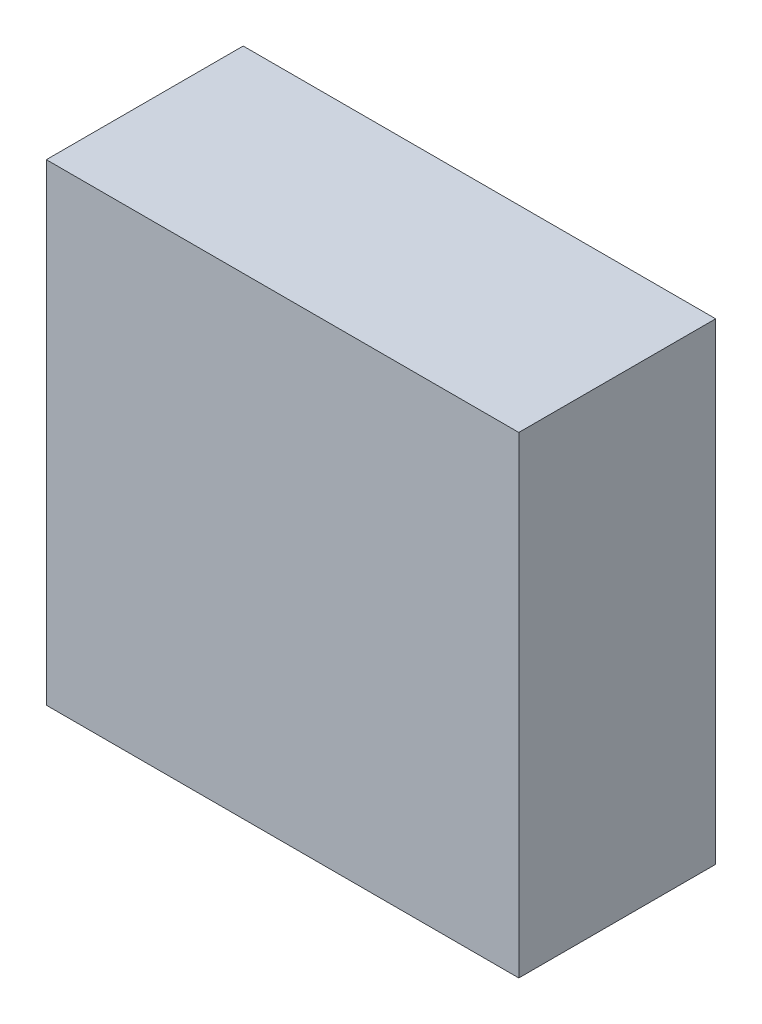
ISO-10303-21;
HEADER;
FILE_DESCRIPTION(('STEP AP214'),'2;1');
FILE_NAME('part.step','',(''),(''),'','','');
FILE_SCHEMA(('AUTOMOTIVE_DESIGN { 1 0 10303 214 1 1 1 1 }'));
ENDSEC;
DATA;
#1=APPLICATION_CONTEXT('core data for automotive mechanical design processes');
#2=APPLICATION_PROTOCOL_DEFINITION('international standard','automotive_design',2000,#1);
#3=PRODUCT_CONTEXT('',#1,'mechanical');
#4=PRODUCT('Part','Part','',(#3));
#5=PRODUCT_RELATED_PRODUCT_CATEGORY('part','',(#4));
#6=PRODUCT_DEFINITION_FORMATION('','',#4);
#7=PRODUCT_DEFINITION_CONTEXT('part definition',#1,'design');
#8=PRODUCT_DEFINITION('design','',#6,#7);
#9=PRODUCT_DEFINITION_SHAPE('','',#8);
#10=(LENGTH_UNIT() NAMED_UNIT(*) SI_UNIT(.MILLI.,.METRE.));
#11=(NAMED_UNIT(*) PLANE_ANGLE_UNIT() SI_UNIT($,.RADIAN.));
#12=(NAMED_UNIT(*) SI_UNIT($,.STERADIAN.) SOLID_ANGLE_UNIT());
#13=UNCERTAINTY_MEASURE_WITH_UNIT(LENGTH_MEASURE(1.E-05),#10,'distance_accuracy_value','');
#14=(GEOMETRIC_REPRESENTATION_CONTEXT(3) GLOBAL_UNCERTAINTY_ASSIGNED_CONTEXT((#13)) GLOBAL_UNIT_ASSIGNED_CONTEXT((#10,
#11,#12)) REPRESENTATION_CONTEXT('',''));
#15=CARTESIAN_POINT('',(0.,0.,0.));
#16=DIRECTION('',(0.,0.,1.));
#17=DIRECTION('',(1.,0.,0.));
#18=AXIS2_PLACEMENT_3D('',#15,#16,#17);
#19=CARTESIAN_POINT('',(6.,6.00000000000001,5.));
#20=DIRECTION('',(-1.,0.,0.));
#21=DIRECTION('',(0.,-1.,0.));
#22=AXIS2_PLACEMENT_3D('',#19,#20,#21);
#23=PLANE('',#22);
#24=DIRECTION('',(0.,1.,0.));
#25=VECTOR('',#24,1.);
#26=CARTESIAN_POINT('',(6.,6.00000000000001,0.));
#27=LINE('',#26,#25);
#28=CARTESIAN_POINT('',(6.,-5.99999999999999,0.));
#29=VERTEX_POINT('',#28);
#30=CARTESIAN_POINT('',(6.,6.00000000000001,0.));
#31=VERTEX_POINT('',#30);
#32=EDGE_CURVE('E96',#29,#31,#27,.T.);
#33=ORIENTED_EDGE('',*,*,#32,.T.);
#34=DIRECTION('',(0.,0.,-1.));
#35=VECTOR('',#34,1.);
#36=CARTESIAN_POINT('',(6.,6.00000000000001,5.));
#37=LINE('',#36,#35);
#38=CARTESIAN_POINT('',(6.,6.00000000000001,5.));
#39=VERTEX_POINT('',#38);
#40=EDGE_CURVE('E11',#39,#31,#37,.T.);
#41=ORIENTED_EDGE('',*,*,#40,.F.);
#42=DIRECTION('',(0.,1.,0.));
#43=VECTOR('',#42,1.);
#44=CARTESIAN_POINT('',(6.,6.00000000000001,5.));
#45=LINE('',#44,#43);
#46=CARTESIAN_POINT('',(6.,-5.99999999999999,5.));
#47=VERTEX_POINT('',#46);
#48=EDGE_CURVE('E84',#47,#39,#45,.T.);
#49=ORIENTED_EDGE('',*,*,#48,.F.);
#50=DIRECTION('',(0.,0.,-1.));
#51=VECTOR('',#50,1.);
#52=CARTESIAN_POINT('',(6.,-5.99999999999999,5.));
#53=LINE('',#52,#51);
#54=EDGE_CURVE('E92',#47,#29,#53,.T.);
#55=ORIENTED_EDGE('',*,*,#54,.T.);
#56=EDGE_LOOP('',(#33,#41,#49,#55));
#57=FACE_BOUND('',#56,.T.);
#58=ADVANCED_FACE('F33',(#57),#23,.F.);
#59=CARTESIAN_POINT('',(6.,6.00000000000001,5.));
#60=DIRECTION('',(0.,-1.,0.));
#61=DIRECTION('',(1.,0.,0.));
#62=AXIS2_PLACEMENT_3D('',#59,#60,#61);
#63=PLANE('',#62);
#64=DIRECTION('',(-1.,0.,0.));
#65=VECTOR('',#64,1.);
#66=CARTESIAN_POINT('',(6.,6.00000000000001,0.));
#67=LINE('',#66,#65);
#68=CARTESIAN_POINT('',(-6.,6.,0.));
#69=VERTEX_POINT('',#68);
#70=EDGE_CURVE('E88',#31,#69,#67,.T.);
#71=ORIENTED_EDGE('',*,*,#70,.T.);
#72=DIRECTION('',(0.,0.,-1.));
#73=VECTOR('',#72,1.);
#74=CARTESIAN_POINT('',(-6.,6.,5.));
#75=LINE('',#74,#73);
#76=CARTESIAN_POINT('',(-6.,6.,5.));
#77=VERTEX_POINT('',#76);
#78=EDGE_CURVE('E41',#77,#69,#75,.T.);
#79=ORIENTED_EDGE('',*,*,#78,.F.);
#80=DIRECTION('',(-1.,0.,0.));
#81=VECTOR('',#80,1.);
#82=CARTESIAN_POINT('',(6.,6.00000000000001,5.));
#83=LINE('',#82,#81);
#84=EDGE_CURVE('E79',#39,#77,#83,.T.);
#85=ORIENTED_EDGE('',*,*,#84,.F.);
#86=ORIENTED_EDGE('',*,*,#40,.T.);
#87=EDGE_LOOP('',(#71,#79,#85,#86));
#88=FACE_BOUND('',#87,.T.);
#89=ADVANCED_FACE('F87',(#88),#63,.F.);
#90=CARTESIAN_POINT('',(-6.,6.,5.));
#91=DIRECTION('',(1.,0.,0.));
#92=DIRECTION('',(0.,1.,0.));
#93=AXIS2_PLACEMENT_3D('',#90,#91,#92);
#94=PLANE('',#93);
#95=DIRECTION('',(0.,-1.,0.));
#96=VECTOR('',#95,1.);
#97=CARTESIAN_POINT('',(-6.,6.,0.));
#98=LINE('',#97,#96);
#99=CARTESIAN_POINT('',(-6.,-6.,0.));
#100=VERTEX_POINT('',#99);
#101=EDGE_CURVE('E66',#69,#100,#98,.T.);
#102=ORIENTED_EDGE('',*,*,#101,.T.);
#103=DIRECTION('',(0.,0.,-1.));
#104=VECTOR('',#103,1.);
#105=CARTESIAN_POINT('',(-6.,-6.,5.));
#106=LINE('',#105,#104);
#107=CARTESIAN_POINT('',(-6.,-6.,5.));
#108=VERTEX_POINT('',#107);
#109=EDGE_CURVE('E89',#108,#100,#106,.T.);
#110=ORIENTED_EDGE('',*,*,#109,.F.);
#111=DIRECTION('',(0.,-1.,0.));
#112=VECTOR('',#111,1.);
#113=CARTESIAN_POINT('',(-6.,6.,5.));
#114=LINE('',#113,#112);
#115=EDGE_CURVE('E82',#77,#108,#114,.T.);
#116=ORIENTED_EDGE('',*,*,#115,.F.);
#117=ORIENTED_EDGE('',*,*,#78,.T.);
#118=EDGE_LOOP('',(#102,#110,#116,#117));
#119=FACE_BOUND('',#118,.T.);
#120=ADVANCED_FACE('F90',(#119),#94,.F.);
#121=CARTESIAN_POINT('',(6.,-5.99999999999999,5.));
#122=DIRECTION('',(0.,1.,0.));
#123=DIRECTION('',(-1.,0.,0.));
#124=AXIS2_PLACEMENT_3D('',#121,#122,#123);
#125=PLANE('',#124);
#126=DIRECTION('',(1.,0.,0.));
#127=VECTOR('',#126,1.);
#128=CARTESIAN_POINT('',(6.,-5.99999999999999,0.));
#129=LINE('',#128,#127);
#130=EDGE_CURVE('E72',#100,#29,#129,.T.);
#131=ORIENTED_EDGE('',*,*,#130,.T.);
#132=ORIENTED_EDGE('',*,*,#54,.F.);
#133=DIRECTION('',(1.,0.,0.));
#134=VECTOR('',#133,1.);
#135=CARTESIAN_POINT('',(6.,-5.99999999999999,5.));
#136=LINE('',#135,#134);
#137=EDGE_CURVE('E49',#108,#47,#136,.T.);
#138=ORIENTED_EDGE('',*,*,#137,.F.);
#139=ORIENTED_EDGE('',*,*,#109,.T.);
#140=EDGE_LOOP('',(#131,#132,#138,#139));
#141=FACE_BOUND('',#140,.T.);
#142=ADVANCED_FACE('F103',(#141),#125,.F.);
#143=CARTESIAN_POINT('',(0.,0.,5.));
#144=DIRECTION('',(0.,0.,-1.));
#145=DIRECTION('',(-1.,0.,0.));
#146=AXIS2_PLACEMENT_3D('',#143,#144,#145);
#147=PLANE('',#146);
#148=ORIENTED_EDGE('',*,*,#48,.T.);
#149=ORIENTED_EDGE('',*,*,#84,.T.);
#150=ORIENTED_EDGE('',*,*,#115,.T.);
#151=ORIENTED_EDGE('',*,*,#137,.T.);
#152=EDGE_LOOP('',(#148,#149,#150,#151));
#153=FACE_BOUND('',#152,.T.);
#154=ADVANCED_FACE('F80',(#153),#147,.F.);
#155=CARTESIAN_POINT('',(0.,0.,0.));
#156=DIRECTION('',(0.,0.,-1.));
#157=DIRECTION('',(-1.,0.,0.));
#158=AXIS2_PLACEMENT_3D('',#155,#156,#157);
#159=PLANE('',#158);
#160=ORIENTED_EDGE('',*,*,#32,.F.);
#161=ORIENTED_EDGE('',*,*,#130,.F.);
#162=ORIENTED_EDGE('',*,*,#101,.F.);
#163=ORIENTED_EDGE('',*,*,#70,.F.);
#164=EDGE_LOOP('',(#160,#161,#162,#163));
#165=FACE_BOUND('',#164,.T.);
#166=ADVANCED_FACE('F106',(#165),#159,.T.);
#167=CLOSED_SHELL('',(#58,#89,#120,#142,#154,#166));
#168=MANIFOLD_SOLID_BREP('B2',#167);
#169=ADVANCED_BREP_SHAPE_REPRESENTATION('',(#18,#168),#14);
#170=SHAPE_DEFINITION_REPRESENTATION(#9,#169);
ENDSEC;
END-ISO-10303-21;
